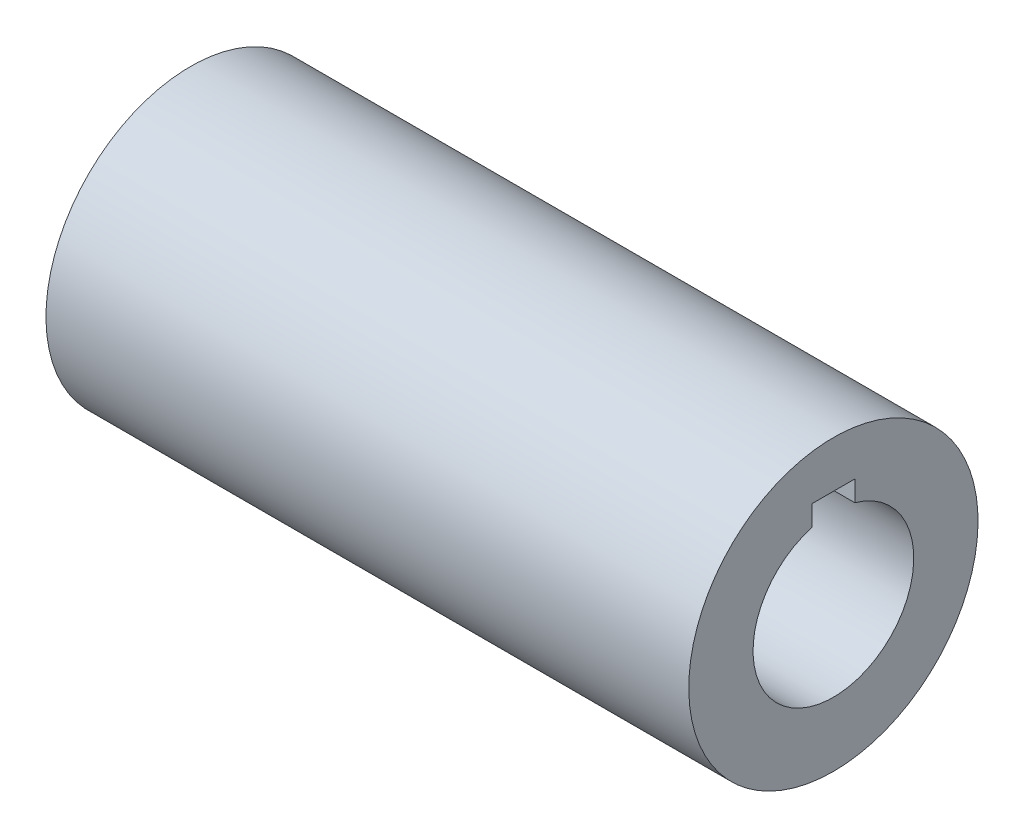
ISO-10303-21;
HEADER;
FILE_DESCRIPTION(('STEP AP214'),'2;1');
FILE_NAME('part.step','',(''),(''),'','','');
FILE_SCHEMA(('AUTOMOTIVE_DESIGN { 1 0 10303 214 1 1 1 1 }'));
ENDSEC;
DATA;
#1=APPLICATION_CONTEXT('core data for automotive mechanical design processes');
#2=APPLICATION_PROTOCOL_DEFINITION('international standard','automotive_design',2000,#1);
#3=PRODUCT_CONTEXT('',#1,'mechanical');
#4=PRODUCT('Part','Part','',(#3));
#5=PRODUCT_RELATED_PRODUCT_CATEGORY('part','',(#4));
#6=PRODUCT_DEFINITION_FORMATION('','',#4);
#7=PRODUCT_DEFINITION_CONTEXT('part definition',#1,'design');
#8=PRODUCT_DEFINITION('design','',#6,#7);
#9=PRODUCT_DEFINITION_SHAPE('','',#8);
#10=(LENGTH_UNIT() NAMED_UNIT(*) SI_UNIT(.MILLI.,.METRE.));
#11=(NAMED_UNIT(*) PLANE_ANGLE_UNIT() SI_UNIT($,.RADIAN.));
#12=(NAMED_UNIT(*) SI_UNIT($,.STERADIAN.) SOLID_ANGLE_UNIT());
#13=UNCERTAINTY_MEASURE_WITH_UNIT(LENGTH_MEASURE(1.E-05),#10,'distance_accuracy_value','');
#14=(GEOMETRIC_REPRESENTATION_CONTEXT(3) GLOBAL_UNCERTAINTY_ASSIGNED_CONTEXT((#13)) GLOBAL_UNIT_ASSIGNED_CONTEXT((#10,
#11,#12)) REPRESENTATION_CONTEXT('',''));
#15=CARTESIAN_POINT('',(0.,0.,0.));
#16=DIRECTION('',(0.,0.,1.));
#17=DIRECTION('',(1.,0.,0.));
#18=AXIS2_PLACEMENT_3D('',#15,#16,#17);
#19=CARTESIAN_POINT('',(-60.,15.,0.));
#20=DIRECTION('',(1.,0.,0.));
#21=DIRECTION('',(0.,1.,0.));
#22=AXIS2_PLACEMENT_3D('',#19,#20,#21);
#23=PLANE('',#22);
#24=CARTESIAN_POINT('',(-60.,0.,0.));
#25=DIRECTION('',(-1.,0.,0.));
#26=DIRECTION('',(0.,-1.,0.));
#27=AXIS2_PLACEMENT_3D('',#24,#25,#26);
#28=CIRCLE('',#27,27.);
#29=CARTESIAN_POINT('',(-60.,-27.,0.));
#30=VERTEX_POINT('',#29);
#31=EDGE_CURVE('E109',#30,#30,#28,.T.);
#32=ORIENTED_EDGE('',*,*,#31,.T.);
#33=EDGE_LOOP('',(#32));
#34=FACE_BOUND('',#33,.T.);
#35=DIRECTION('',(0.,-1.,0.));
#36=VECTOR('',#35,1.);
#37=CARTESIAN_POINT('',(-60.,18.3,4.));
#38=LINE('',#37,#36);
#39=CARTESIAN_POINT('',(-60.,18.3,4.));
#40=VERTEX_POINT('',#39);
#41=CARTESIAN_POINT('',(-60.,14.456832294801,4.));
#42=VERTEX_POINT('',#41);
#43=EDGE_CURVE('E84',#40,#42,#38,.T.);
#44=ORIENTED_EDGE('',*,*,#43,.T.);
#45=CARTESIAN_POINT('',(-60.,0.,0.));
#46=DIRECTION('',(-1.,0.,0.));
#47=DIRECTION('',(0.,-1.,0.));
#48=AXIS2_PLACEMENT_3D('',#45,#46,#47);
#49=CIRCLE('',#48,15.);
#50=CARTESIAN_POINT('',(-60.,14.456832294801,-4.));
#51=VERTEX_POINT('',#50);
#52=EDGE_CURVE('E89',#51,#42,#49,.T.);
#53=ORIENTED_EDGE('',*,*,#52,.F.);
#54=DIRECTION('',(0.,-1.,0.));
#55=VECTOR('',#54,1.);
#56=CARTESIAN_POINT('',(-60.,18.3,-4.));
#57=LINE('',#56,#55);
#58=CARTESIAN_POINT('',(-60.,18.3,-4.));
#59=VERTEX_POINT('',#58);
#60=EDGE_CURVE('E50',#59,#51,#57,.T.);
#61=ORIENTED_EDGE('',*,*,#60,.F.);
#62=DIRECTION('',(0.,0.,1.));
#63=VECTOR('',#62,1.);
#64=CARTESIAN_POINT('',(-60.,18.3,-4.));
#65=LINE('',#64,#63);
#66=EDGE_CURVE('E79',#59,#40,#65,.T.);
#67=ORIENTED_EDGE('',*,*,#66,.T.);
#68=EDGE_LOOP('',(#44,#53,#61,#67));
#69=FACE_BOUND('',#68,.T.);
#70=ADVANCED_FACE('F36',(#34,#69),#23,.F.);
#71=CARTESIAN_POINT('',(60.,15.,0.));
#72=DIRECTION('',(-1.,0.,0.));
#73=DIRECTION('',(0.,-1.,0.));
#74=AXIS2_PLACEMENT_3D('',#71,#72,#73);
#75=PLANE('',#74);
#76=CARTESIAN_POINT('',(60.,0.,0.));
#77=DIRECTION('',(-1.,0.,0.));
#78=DIRECTION('',(0.,-1.,0.));
#79=AXIS2_PLACEMENT_3D('',#76,#77,#78);
#80=CIRCLE('',#79,27.);
#81=CARTESIAN_POINT('',(60.,-26.9999999999999,0.));
#82=VERTEX_POINT('',#81);
#83=EDGE_CURVE('E106',#82,#82,#80,.T.);
#84=ORIENTED_EDGE('',*,*,#83,.F.);
#85=EDGE_LOOP('',(#84));
#86=FACE_BOUND('',#85,.T.);
#87=DIRECTION('',(0.,-1.,0.));
#88=VECTOR('',#87,1.);
#89=CARTESIAN_POINT('',(60.,18.3,3.99999999999996));
#90=LINE('',#89,#88);
#91=CARTESIAN_POINT('',(60.,18.3,3.99999999999996));
#92=VERTEX_POINT('',#91);
#93=CARTESIAN_POINT('',(60.,14.456832294801,3.99999999999996));
#94=VERTEX_POINT('',#93);
#95=EDGE_CURVE('E90',#92,#94,#90,.T.);
#96=ORIENTED_EDGE('',*,*,#95,.F.);
#97=DIRECTION('',(0.,0.,-1.));
#98=VECTOR('',#97,1.);
#99=CARTESIAN_POINT('',(60.,18.3,-4.));
#100=LINE('',#99,#98);
#101=CARTESIAN_POINT('',(60.,18.3,-4.));
#102=VERTEX_POINT('',#101);
#103=EDGE_CURVE('E81',#92,#102,#100,.T.);
#104=ORIENTED_EDGE('',*,*,#103,.T.);
#105=DIRECTION('',(0.,-1.,0.));
#106=VECTOR('',#105,1.);
#107=CARTESIAN_POINT('',(60.,18.3,-4.));
#108=LINE('',#107,#106);
#109=CARTESIAN_POINT('',(60.,14.456832294801,-4.));
#110=VERTEX_POINT('',#109);
#111=EDGE_CURVE('E98',#102,#110,#108,.T.);
#112=ORIENTED_EDGE('',*,*,#111,.T.);
#113=CARTESIAN_POINT('',(60.,0.,0.));
#114=DIRECTION('',(-1.,0.,0.));
#115=DIRECTION('',(0.,-1.,0.));
#116=AXIS2_PLACEMENT_3D('',#113,#114,#115);
#117=CIRCLE('',#116,15.);
#118=EDGE_CURVE('E103',#110,#94,#117,.T.);
#119=ORIENTED_EDGE('',*,*,#118,.T.);
#120=EDGE_LOOP('',(#96,#104,#112,#119));
#121=FACE_BOUND('',#120,.T.);
#122=ADVANCED_FACE('F115',(#86,#121),#75,.F.);
#123=CARTESIAN_POINT('',(-60.,0.,0.));
#124=DIRECTION('',(-1.,0.,0.));
#125=DIRECTION('',(0.,-1.,0.));
#126=AXIS2_PLACEMENT_3D('',#123,#124,#125);
#127=CYLINDRICAL_SURFACE('',#126,15.);
#128=DIRECTION('',(-1.,0.,0.));
#129=VECTOR('',#128,1.);
#130=CARTESIAN_POINT('',(-60.,14.4568322948009,4.));
#131=LINE('',#130,#129);
#132=EDGE_CURVE('E11',#94,#42,#131,.T.);
#133=ORIENTED_EDGE('',*,*,#132,.F.);
#134=ORIENTED_EDGE('',*,*,#118,.F.);
#135=DIRECTION('',(-1.,0.,0.));
#136=VECTOR('',#135,1.);
#137=CARTESIAN_POINT('',(-60.,14.4568322948009,-4.));
#138=LINE('',#137,#136);
#139=EDGE_CURVE('E43',#51,#110,#138,.F.);
#140=ORIENTED_EDGE('',*,*,#139,.F.);
#141=ORIENTED_EDGE('',*,*,#52,.T.);
#142=EDGE_LOOP('',(#133,#134,#140,#141));
#143=FACE_BOUND('',#142,.T.);
#144=ADVANCED_FACE('F116',(#143),#127,.F.);
#145=CARTESIAN_POINT('',(-60.,0.,0.));
#146=DIRECTION('',(-1.,0.,0.));
#147=DIRECTION('',(0.,-1.,0.));
#148=AXIS2_PLACEMENT_3D('',#145,#146,#147);
#149=CYLINDRICAL_SURFACE('',#148,27.);
#150=ORIENTED_EDGE('',*,*,#31,.F.);
#151=EDGE_LOOP('',(#150));
#152=FACE_BOUND('',#151,.T.);
#153=ORIENTED_EDGE('',*,*,#83,.T.);
#154=EDGE_LOOP('',(#153));
#155=FACE_BOUND('',#154,.T.);
#156=ADVANCED_FACE('F118',(#152,#155),#149,.T.);
#157=CARTESIAN_POINT('',(-60.,18.3,4.));
#158=DIRECTION('',(0.,0.,-1.));
#159=DIRECTION('',(-1.,0.,0.));
#160=AXIS2_PLACEMENT_3D('',#157,#158,#159);
#161=PLANE('',#160);
#162=ORIENTED_EDGE('',*,*,#132,.T.);
#163=ORIENTED_EDGE('',*,*,#43,.F.);
#164=DIRECTION('',(1.,0.,0.));
#165=VECTOR('',#164,1.);
#166=CARTESIAN_POINT('',(-60.,18.3,4.));
#167=LINE('',#166,#165);
#168=EDGE_CURVE('E75',#40,#92,#167,.T.);
#169=ORIENTED_EDGE('',*,*,#168,.T.);
#170=ORIENTED_EDGE('',*,*,#95,.T.);
#171=EDGE_LOOP('',(#162,#163,#169,#170));
#172=FACE_BOUND('',#171,.T.);
#173=ADVANCED_FACE('F85',(#172),#161,.T.);
#174=CARTESIAN_POINT('',(-60.,18.3,-4.));
#175=DIRECTION('',(0.,0.,1.));
#176=DIRECTION('',(1.,0.,0.));
#177=AXIS2_PLACEMENT_3D('',#174,#175,#176);
#178=PLANE('',#177);
#179=ORIENTED_EDGE('',*,*,#139,.T.);
#180=ORIENTED_EDGE('',*,*,#111,.F.);
#181=DIRECTION('',(-1.,0.,0.));
#182=VECTOR('',#181,1.);
#183=CARTESIAN_POINT('',(-60.,18.3,-4.));
#184=LINE('',#183,#182);
#185=EDGE_CURVE('E95',#102,#59,#184,.T.);
#186=ORIENTED_EDGE('',*,*,#185,.T.);
#187=ORIENTED_EDGE('',*,*,#60,.T.);
#188=EDGE_LOOP('',(#179,#180,#186,#187));
#189=FACE_BOUND('',#188,.T.);
#190=ADVANCED_FACE('F111',(#189),#178,.T.);
#191=CARTESIAN_POINT('',(0.,18.3,0.));
#192=DIRECTION('',(0.,1.,0.));
#193=DIRECTION('',(0.,0.,1.));
#194=AXIS2_PLACEMENT_3D('',#191,#192,#193);
#195=PLANE('',#194);
#196=ORIENTED_EDGE('',*,*,#66,.F.);
#197=ORIENTED_EDGE('',*,*,#185,.F.);
#198=ORIENTED_EDGE('',*,*,#103,.F.);
#199=ORIENTED_EDGE('',*,*,#168,.F.);
#200=EDGE_LOOP('',(#196,#197,#198,#199));
#201=FACE_BOUND('',#200,.T.);
#202=ADVANCED_FACE('F76',(#201),#195,.F.);
#203=CLOSED_SHELL('',(#70,#122,#144,#156,#173,#190,#202));
#204=MANIFOLD_SOLID_BREP('B2',#203);
#205=ADVANCED_BREP_SHAPE_REPRESENTATION('',(#18,#204),#14);
#206=SHAPE_DEFINITION_REPRESENTATION(#9,#205);
ENDSEC;
END-ISO-10303-21;
